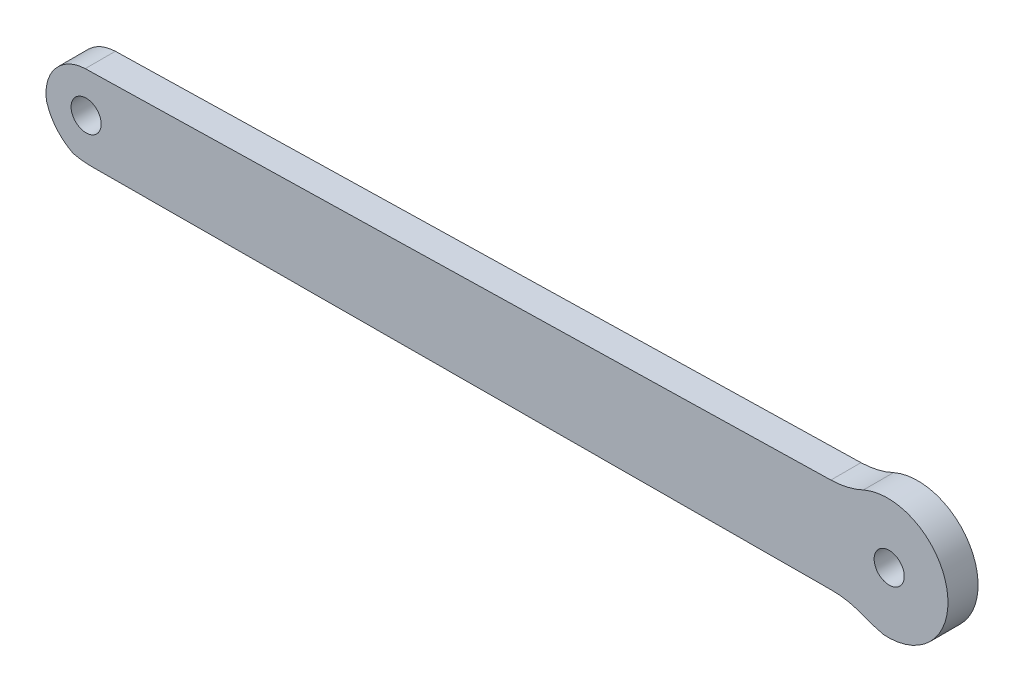
ISO-10303-21;
HEADER;
FILE_DESCRIPTION(('STEP AP214'),'2;1');
FILE_NAME('part.step','',(''),(''),'','','');
FILE_SCHEMA(('AUTOMOTIVE_DESIGN { 1 0 10303 214 1 1 1 1 }'));
ENDSEC;
DATA;
#1=APPLICATION_CONTEXT('core data for automotive mechanical design processes');
#2=APPLICATION_PROTOCOL_DEFINITION('international standard','automotive_design',2000,#1);
#3=PRODUCT_CONTEXT('',#1,'mechanical');
#4=PRODUCT('Part','Part','',(#3));
#5=PRODUCT_RELATED_PRODUCT_CATEGORY('part','',(#4));
#6=PRODUCT_DEFINITION_FORMATION('','',#4);
#7=PRODUCT_DEFINITION_CONTEXT('part definition',#1,'design');
#8=PRODUCT_DEFINITION('design','',#6,#7);
#9=PRODUCT_DEFINITION_SHAPE('','',#8);
#10=(LENGTH_UNIT() NAMED_UNIT(*) SI_UNIT(.MILLI.,.METRE.));
#11=(NAMED_UNIT(*) PLANE_ANGLE_UNIT() SI_UNIT($,.RADIAN.));
#12=(NAMED_UNIT(*) SI_UNIT($,.STERADIAN.) SOLID_ANGLE_UNIT());
#13=UNCERTAINTY_MEASURE_WITH_UNIT(LENGTH_MEASURE(1.E-05),#10,'distance_accuracy_value','');
#14=(GEOMETRIC_REPRESENTATION_CONTEXT(3) GLOBAL_UNCERTAINTY_ASSIGNED_CONTEXT((#13)) GLOBAL_UNIT_ASSIGNED_CONTEXT((#10,
#11,#12)) REPRESENTATION_CONTEXT('',''));
#15=CARTESIAN_POINT('',(0.,0.,0.));
#16=DIRECTION('',(0.,0.,1.));
#17=DIRECTION('',(1.,0.,0.));
#18=AXIS2_PLACEMENT_3D('',#15,#16,#17);
#19=CARTESIAN_POINT('',(83.7867001555837,164.469026190635,3.));
#20=DIRECTION('',(0.,0.,1.));
#21=DIRECTION('',(1.,0.,0.));
#22=AXIS2_PLACEMENT_3D('',#19,#20,#21);
#23=PLANE('',#22);
#24=CARTESIAN_POINT('',(89.7718472401299,151.812467685397,3.));
#25=DIRECTION('',(0.,0.,1.));
#26=DIRECTION('',(1.,0.,0.));
#27=AXIS2_PLACEMENT_3D('',#24,#25,#26);
#28=CIRCLE('',#27,1.49999999999998);
#29=CARTESIAN_POINT('',(91.2718472401299,151.812467685397,3.));
#30=VERTEX_POINT('',#29);
#31=EDGE_CURVE('E146',#30,#30,#28,.T.);
#32=ORIENTED_EDGE('',*,*,#31,.F.);
#33=EDGE_LOOP('',(#32));
#34=FACE_BOUND('',#33,.T.);
#35=CARTESIAN_POINT('',(83.7867001555837,164.469026190635,3.));
#36=DIRECTION('',(0.,0.,-1.));
#37=DIRECTION('',(1.,0.,0.));
#38=AXIS2_PLACEMENT_3D('',#35,#36,#37);
#39=CIRCLE('',#38,8.00040344487922);
#40=CARTESIAN_POINT('',(87.2068985072511,157.236550921677,3.));
#41=VERTEX_POINT('',#40);
#42=CARTESIAN_POINT('',(83.9642785340564,156.470593769195,3.));
#43=VERTEX_POINT('',#42);
#44=EDGE_CURVE('E161',#41,#43,#39,.T.);
#45=ORIENTED_EDGE('',*,*,#44,.T.);
#46=DIRECTION('',(-0.999754351339683,-0.0221638664806151,0.));
#47=VECTOR('',#46,1.);
#48=CARTESIAN_POINT('',(83.9642785340564,156.470593769195,3.));
#49=LINE('',#48,#47);
#50=CARTESIAN_POINT('',(9.68932855910709,154.823969203977,3.));
#51=VERTEX_POINT('',#50);
#52=EDGE_CURVE('E99',#43,#51,#49,.T.);
#53=ORIENTED_EDGE('',*,*,#52,.T.);
#54=CARTESIAN_POINT('',(9.85852986234285,150.747145406072,3.));
#55=DIRECTION('',(0.,0.,1.));
#56=DIRECTION('',(1.,0.,0.));
#57=AXIS2_PLACEMENT_3D('',#54,#55,#56);
#58=CIRCLE('',#57,4.08033348639364);
#59=CARTESIAN_POINT('',(5.82514565190696,150.129947568104,3.));
#60=VERTEX_POINT('',#59);
#61=EDGE_CURVE('E182',#51,#60,#58,.T.);
#62=ORIENTED_EDGE('',*,*,#61,.T.);
#63=CARTESIAN_POINT('',(10.8090030725797,151.532819219976,3.));
#64=DIRECTION('',(0.,0.,1.));
#65=DIRECTION('',(1.,0.,0.));
#66=AXIS2_PLACEMENT_3D('',#63,#64,#65);
#67=CIRCLE('',#66,5.17753644711641);
#68=CARTESIAN_POINT('',(8.49347494000333,146.90192156094,3.));
#69=VERTEX_POINT('',#68);
#70=EDGE_CURVE('E201',#60,#69,#67,.T.);
#71=ORIENTED_EDGE('',*,*,#70,.T.);
#72=CARTESIAN_POINT('',(10.3020977189821,154.695436505625,3.));
#73=DIRECTION('',(0.,0.,1.));
#74=DIRECTION('',(1.,0.,0.));
#75=AXIS2_PLACEMENT_3D('',#72,#73,#74);
#76=CIRCLE('',#75,8.0006244474833);
#77=CARTESIAN_POINT('',(10.3363477725171,146.694885369391,3.));
#78=VERTEX_POINT('',#77);
#79=EDGE_CURVE('E198',#69,#78,#76,.T.);
#80=ORIENTED_EDGE('',*,*,#79,.T.);
#81=DIRECTION('',(0.999990723069275,0.00430740935922885,0.));
#82=VECTOR('',#81,1.);
#83=CARTESIAN_POINT('',(10.3363477725171,146.694885369391,3.));
#84=LINE('',#83,#82);
#85=CARTESIAN_POINT('',(28.4307616397135,146.772826140083,3.));
#86=VERTEX_POINT('',#85);
#87=EDGE_CURVE('E200',#78,#86,#84,.T.);
#88=ORIENTED_EDGE('',*,*,#87,.T.);
#89=DIRECTION('',(0.99999074479343,0.00430236301140441,0.));
#90=VECTOR('',#89,1.);
#91=CARTESIAN_POINT('',(28.4307616397135,146.772826140083,3.));
#92=LINE('',#91,#90);
#93=CARTESIAN_POINT('',(84.0810405641763,147.012256057675,3.));
#94=VERTEX_POINT('',#93);
#95=EDGE_CURVE('E124',#86,#94,#92,.T.);
#96=ORIENTED_EDGE('',*,*,#95,.T.);
#97=CARTESIAN_POINT('',(84.1015346193672,139.013985829993,3.));
#98=DIRECTION('',(0.,0.,-1.));
#99=DIRECTION('',(1.,0.,0.));
#100=AXIS2_PLACEMENT_3D('',#97,#98,#99);
#101=CIRCLE('',#100,7.99829648371016);
#102=CARTESIAN_POINT('',(87.3415370568645,146.326655031204,3.));
#103=VERTEX_POINT('',#102);
#104=EDGE_CURVE('E118',#94,#103,#101,.T.);
#105=ORIENTED_EDGE('',*,*,#104,.T.);
#106=CARTESIAN_POINT('',(93.709289011018,163.980295508004,3.));
#107=DIRECTION('',(0.,0.,1.));
#108=DIRECTION('',(1.,0.,0.));
#109=AXIS2_PLACEMENT_3D('',#106,#107,#108);
#110=CIRCLE('',#109,18.7669733050843);
#111=CARTESIAN_POINT('',(89.2137207556054,145.759726002781,3.));
#112=VERTEX_POINT('',#111);
#113=EDGE_CURVE('E122',#103,#112,#110,.T.);
#114=ORIENTED_EDGE('',*,*,#113,.T.);
#115=CARTESIAN_POINT('',(89.6265375089271,151.745778173856,3.));
#116=DIRECTION('',(0.,0.,1.));
#117=DIRECTION('',(1.,0.,0.));
#118=AXIS2_PLACEMENT_3D('',#115,#116,#117);
#119=CIRCLE('',#118,6.00026984948586);
#120=EDGE_CURVE('E50',#112,#41,#119,.T.);
#121=ORIENTED_EDGE('',*,*,#120,.T.);
#122=EDGE_LOOP('',(#45,#53,#62,#71,#80,#88,#96,#105,#114,#121));
#123=FACE_BOUND('',#122,.T.);
#124=CARTESIAN_POINT('',(9.77798402665884,150.824951800321,3.));
#125=DIRECTION('',(0.,0.,1.));
#126=DIRECTION('',(1.,0.,0.));
#127=AXIS2_PLACEMENT_3D('',#124,#125,#126);
#128=CIRCLE('',#127,1.5);
#129=CARTESIAN_POINT('',(11.2779840266588,150.824951800321,3.));
#130=VERTEX_POINT('',#129);
#131=EDGE_CURVE('E212',#130,#130,#128,.T.);
#132=ORIENTED_EDGE('',*,*,#131,.F.);
#133=EDGE_LOOP('',(#132));
#134=FACE_BOUND('',#133,.T.);
#135=ADVANCED_FACE('F33',(#34,#123,#134),#23,.T.);
#136=CARTESIAN_POINT('',(83.7867001555837,164.469026190635,0.));
#137=DIRECTION('',(0.,0.,1.));
#138=DIRECTION('',(1.,0.,0.));
#139=AXIS2_PLACEMENT_3D('',#136,#137,#138);
#140=PLANE('',#139);
#141=CARTESIAN_POINT('',(83.7867001555837,164.469026190635,0.));
#142=DIRECTION('',(0.,0.,-1.));
#143=DIRECTION('',(1.,0.,0.));
#144=AXIS2_PLACEMENT_3D('',#141,#142,#143);
#145=CIRCLE('',#144,8.00040344487922);
#146=CARTESIAN_POINT('',(87.2068985072511,157.236550921677,0.));
#147=VERTEX_POINT('',#146);
#148=CARTESIAN_POINT('',(83.9642785340564,156.470593769195,0.));
#149=VERTEX_POINT('',#148);
#150=EDGE_CURVE('E142',#147,#149,#145,.T.);
#151=ORIENTED_EDGE('',*,*,#150,.F.);
#152=CARTESIAN_POINT('',(89.6265375089271,151.745778173856,0.));
#153=DIRECTION('',(0.,0.,1.));
#154=DIRECTION('',(1.,0.,0.));
#155=AXIS2_PLACEMENT_3D('',#152,#153,#154);
#156=CIRCLE('',#155,6.00026984948586);
#157=CARTESIAN_POINT('',(89.2137207556054,145.759726002781,0.));
#158=VERTEX_POINT('',#157);
#159=EDGE_CURVE('E91',#158,#147,#156,.T.);
#160=ORIENTED_EDGE('',*,*,#159,.F.);
#161=CARTESIAN_POINT('',(93.709289011018,163.980295508004,0.));
#162=DIRECTION('',(0.,0.,1.));
#163=DIRECTION('',(1.,0.,0.));
#164=AXIS2_PLACEMENT_3D('',#161,#162,#163);
#165=CIRCLE('',#164,18.7669733050843);
#166=CARTESIAN_POINT('',(87.3415370568645,146.326655031204,0.));
#167=VERTEX_POINT('',#166);
#168=EDGE_CURVE('E85',#167,#158,#165,.T.);
#169=ORIENTED_EDGE('',*,*,#168,.F.);
#170=CARTESIAN_POINT('',(84.1015346193672,139.013985829993,0.));
#171=DIRECTION('',(0.,0.,-1.));
#172=DIRECTION('',(1.,0.,0.));
#173=AXIS2_PLACEMENT_3D('',#170,#171,#172);
#174=CIRCLE('',#173,7.99829648371016);
#175=CARTESIAN_POINT('',(84.0810405641763,147.012256057675,0.));
#176=VERTEX_POINT('',#175);
#177=EDGE_CURVE('E132',#176,#167,#174,.T.);
#178=ORIENTED_EDGE('',*,*,#177,.F.);
#179=DIRECTION('',(0.99999074479343,0.00430236301140441,0.));
#180=VECTOR('',#179,1.);
#181=CARTESIAN_POINT('',(28.4307616397135,146.772826140083,0.));
#182=LINE('',#181,#180);
#183=CARTESIAN_POINT('',(28.4307616397135,146.772826140083,0.));
#184=VERTEX_POINT('',#183);
#185=EDGE_CURVE('E156',#184,#176,#182,.T.);
#186=ORIENTED_EDGE('',*,*,#185,.F.);
#187=DIRECTION('',(0.999990723069275,0.00430740935922885,0.));
#188=VECTOR('',#187,1.);
#189=CARTESIAN_POINT('',(10.3363477725171,146.694885369391,0.));
#190=LINE('',#189,#188);
#191=CARTESIAN_POINT('',(10.3363477725171,146.694885369391,0.));
#192=VERTEX_POINT('',#191);
#193=EDGE_CURVE('E154',#192,#184,#190,.T.);
#194=ORIENTED_EDGE('',*,*,#193,.F.);
#195=CARTESIAN_POINT('',(10.3020977189821,154.695436505625,0.));
#196=DIRECTION('',(0.,0.,1.));
#197=DIRECTION('',(1.,0.,0.));
#198=AXIS2_PLACEMENT_3D('',#195,#196,#197);
#199=CIRCLE('',#198,8.0006244474833);
#200=CARTESIAN_POINT('',(8.49347494000333,146.90192156094,0.));
#201=VERTEX_POINT('',#200);
#202=EDGE_CURVE('E152',#201,#192,#199,.T.);
#203=ORIENTED_EDGE('',*,*,#202,.F.);
#204=CARTESIAN_POINT('',(10.8090030725797,151.532819219976,0.));
#205=DIRECTION('',(0.,0.,1.));
#206=DIRECTION('',(1.,0.,0.));
#207=AXIS2_PLACEMENT_3D('',#204,#205,#206);
#208=CIRCLE('',#207,5.17753644711641);
#209=CARTESIAN_POINT('',(5.82514565190696,150.129947568104,0.));
#210=VERTEX_POINT('',#209);
#211=EDGE_CURVE('E150',#210,#201,#208,.T.);
#212=ORIENTED_EDGE('',*,*,#211,.F.);
#213=CARTESIAN_POINT('',(9.85852986234285,150.747145406072,0.));
#214=DIRECTION('',(0.,0.,1.));
#215=DIRECTION('',(1.,0.,0.));
#216=AXIS2_PLACEMENT_3D('',#213,#214,#215);
#217=CIRCLE('',#216,4.08033348639364);
#218=CARTESIAN_POINT('',(9.68932855910709,154.823969203977,0.));
#219=VERTEX_POINT('',#218);
#220=EDGE_CURVE('E148',#219,#210,#217,.T.);
#221=ORIENTED_EDGE('',*,*,#220,.F.);
#222=DIRECTION('',(-0.999754351339683,-0.0221638664806151,0.));
#223=VECTOR('',#222,1.);
#224=CARTESIAN_POINT('',(83.9642785340564,156.470593769195,0.));
#225=LINE('',#224,#223);
#226=EDGE_CURVE('E145',#149,#219,#225,.T.);
#227=ORIENTED_EDGE('',*,*,#226,.F.);
#228=EDGE_LOOP('',(#151,#160,#169,#178,#186,#194,#203,#212,#221,#227));
#229=FACE_BOUND('',#228,.T.);
#230=CARTESIAN_POINT('',(89.7718472401299,151.812467685397,0.));
#231=DIRECTION('',(0.,0.,1.));
#232=DIRECTION('',(1.,0.,0.));
#233=AXIS2_PLACEMENT_3D('',#230,#231,#232);
#234=CIRCLE('',#233,1.49999999999998);
#235=CARTESIAN_POINT('',(91.2718472401299,151.812467685397,0.));
#236=VERTEX_POINT('',#235);
#237=EDGE_CURVE('E209',#236,#236,#234,.T.);
#238=ORIENTED_EDGE('',*,*,#237,.T.);
#239=EDGE_LOOP('',(#238));
#240=FACE_BOUND('',#239,.T.);
#241=CARTESIAN_POINT('',(9.77798402665884,150.824951800321,0.));
#242=DIRECTION('',(0.,0.,1.));
#243=DIRECTION('',(1.,0.,0.));
#244=AXIS2_PLACEMENT_3D('',#241,#242,#243);
#245=CIRCLE('',#244,1.5);
#246=CARTESIAN_POINT('',(11.2779840266588,150.824951800321,0.));
#247=VERTEX_POINT('',#246);
#248=EDGE_CURVE('E215',#247,#247,#245,.T.);
#249=ORIENTED_EDGE('',*,*,#248,.T.);
#250=EDGE_LOOP('',(#249));
#251=FACE_BOUND('',#250,.T.);
#252=ADVANCED_FACE('F186',(#229,#240,#251),#140,.F.);
#253=CARTESIAN_POINT('',(83.7867001555837,164.469026190635,3.));
#254=DIRECTION('',(0.,0.,-1.));
#255=DIRECTION('',(-1.,0.,0.));
#256=AXIS2_PLACEMENT_3D('',#253,#254,#255);
#257=CYLINDRICAL_SURFACE('',#256,8.00040344487922);
#258=ORIENTED_EDGE('',*,*,#150,.T.);
#259=DIRECTION('',(0.,0.,-1.));
#260=VECTOR('',#259,1.);
#261=CARTESIAN_POINT('',(83.9642785340564,156.470593769195,3.));
#262=LINE('',#261,#260);
#263=EDGE_CURVE('E11',#43,#149,#262,.T.);
#264=ORIENTED_EDGE('',*,*,#263,.F.);
#265=ORIENTED_EDGE('',*,*,#44,.F.);
#266=DIRECTION('',(0.,0.,-1.));
#267=VECTOR('',#266,1.);
#268=CARTESIAN_POINT('',(87.2068985072511,157.236550921677,3.));
#269=LINE('',#268,#267);
#270=EDGE_CURVE('E138',#41,#147,#269,.T.);
#271=ORIENTED_EDGE('',*,*,#270,.T.);
#272=EDGE_LOOP('',(#258,#264,#265,#271));
#273=FACE_BOUND('',#272,.T.);
#274=ADVANCED_FACE('F35',(#273),#257,.F.);
#275=CARTESIAN_POINT('',(83.9642785340564,156.470593769195,3.));
#276=DIRECTION('',(0.0221638664806151,-0.999754351339682,0.));
#277=DIRECTION('',(0.999754351339683,0.0221638664806151,0.));
#278=AXIS2_PLACEMENT_3D('',#275,#276,#277);
#279=PLANE('',#278);
#280=ORIENTED_EDGE('',*,*,#226,.T.);
#281=DIRECTION('',(0.,0.,-1.));
#282=VECTOR('',#281,1.);
#283=CARTESIAN_POINT('',(9.68932855910709,154.823969203977,3.));
#284=LINE('',#283,#282);
#285=EDGE_CURVE('E42',#51,#219,#284,.T.);
#286=ORIENTED_EDGE('',*,*,#285,.F.);
#287=ORIENTED_EDGE('',*,*,#52,.F.);
#288=ORIENTED_EDGE('',*,*,#263,.T.);
#289=EDGE_LOOP('',(#280,#286,#287,#288));
#290=FACE_BOUND('',#289,.T.);
#291=ADVANCED_FACE('F255',(#290),#279,.F.);
#292=CARTESIAN_POINT('',(9.85852986234285,150.747145406072,3.));
#293=DIRECTION('',(0.,0.,-1.));
#294=DIRECTION('',(-1.,0.,0.));
#295=AXIS2_PLACEMENT_3D('',#292,#293,#294);
#296=CYLINDRICAL_SURFACE('',#295,4.08033348639364);
#297=ORIENTED_EDGE('',*,*,#220,.T.);
#298=DIRECTION('',(0.,0.,-1.));
#299=VECTOR('',#298,1.);
#300=CARTESIAN_POINT('',(5.82514565190696,150.129947568104,3.));
#301=LINE('',#300,#299);
#302=EDGE_CURVE('E174',#60,#210,#301,.T.);
#303=ORIENTED_EDGE('',*,*,#302,.F.);
#304=ORIENTED_EDGE('',*,*,#61,.F.);
#305=ORIENTED_EDGE('',*,*,#285,.T.);
#306=EDGE_LOOP('',(#297,#303,#304,#305));
#307=FACE_BOUND('',#306,.T.);
#308=ADVANCED_FACE('F180',(#307),#296,.T.);
#309=CARTESIAN_POINT('',(10.8090030725797,151.532819219976,3.));
#310=DIRECTION('',(0.,0.,-1.));
#311=DIRECTION('',(-1.,0.,0.));
#312=AXIS2_PLACEMENT_3D('',#309,#310,#311);
#313=CYLINDRICAL_SURFACE('',#312,5.17753644711641);
#314=ORIENTED_EDGE('',*,*,#211,.T.);
#315=DIRECTION('',(0.,0.,-1.));
#316=VECTOR('',#315,1.);
#317=CARTESIAN_POINT('',(8.49347494000333,146.90192156094,3.));
#318=LINE('',#317,#316);
#319=EDGE_CURVE('E171',#69,#201,#318,.T.);
#320=ORIENTED_EDGE('',*,*,#319,.F.);
#321=ORIENTED_EDGE('',*,*,#70,.F.);
#322=ORIENTED_EDGE('',*,*,#302,.T.);
#323=EDGE_LOOP('',(#314,#320,#321,#322));
#324=FACE_BOUND('',#323,.T.);
#325=ADVANCED_FACE('F192',(#324),#313,.T.);
#326=CARTESIAN_POINT('',(10.3020977189821,154.695436505625,3.));
#327=DIRECTION('',(0.,0.,-1.));
#328=DIRECTION('',(-1.,0.,0.));
#329=AXIS2_PLACEMENT_3D('',#326,#327,#328);
#330=CYLINDRICAL_SURFACE('',#329,8.0006244474833);
#331=ORIENTED_EDGE('',*,*,#202,.T.);
#332=DIRECTION('',(0.,0.,-1.));
#333=VECTOR('',#332,1.);
#334=CARTESIAN_POINT('',(10.3363477725171,146.694885369391,3.));
#335=LINE('',#334,#333);
#336=EDGE_CURVE('E168',#78,#192,#335,.T.);
#337=ORIENTED_EDGE('',*,*,#336,.F.);
#338=ORIENTED_EDGE('',*,*,#79,.F.);
#339=ORIENTED_EDGE('',*,*,#319,.T.);
#340=EDGE_LOOP('',(#331,#337,#338,#339));
#341=FACE_BOUND('',#340,.T.);
#342=ADVANCED_FACE('F196',(#341),#330,.T.);
#343=CARTESIAN_POINT('',(10.3363477725171,146.694885369391,3.));
#344=DIRECTION('',(-0.00430740935922885,0.999990723069275,0.));
#345=DIRECTION('',(-0.999990723069275,-0.00430740935922885,0.));
#346=AXIS2_PLACEMENT_3D('',#343,#344,#345);
#347=PLANE('',#346);
#348=ORIENTED_EDGE('',*,*,#193,.T.);
#349=DIRECTION('',(0.,0.,-1.));
#350=VECTOR('',#349,1.);
#351=CARTESIAN_POINT('',(28.4307616397135,146.772826140083,3.));
#352=LINE('',#351,#350);
#353=EDGE_CURVE('E165',#86,#184,#352,.T.);
#354=ORIENTED_EDGE('',*,*,#353,.F.);
#355=ORIENTED_EDGE('',*,*,#87,.F.);
#356=ORIENTED_EDGE('',*,*,#336,.T.);
#357=EDGE_LOOP('',(#348,#354,#355,#356));
#358=FACE_BOUND('',#357,.T.);
#359=ADVANCED_FACE('F245',(#358),#347,.F.);
#360=CARTESIAN_POINT('',(28.4307616397135,146.772826140083,3.));
#361=DIRECTION('',(-0.00430236301140441,0.99999074479343,0.));
#362=DIRECTION('',(-0.99999074479343,-0.00430236301140441,0.));
#363=AXIS2_PLACEMENT_3D('',#360,#361,#362);
#364=PLANE('',#363);
#365=ORIENTED_EDGE('',*,*,#185,.T.);
#366=DIRECTION('',(0.,0.,-1.));
#367=VECTOR('',#366,1.);
#368=CARTESIAN_POINT('',(84.0810405641763,147.012256057675,3.));
#369=LINE('',#368,#367);
#370=EDGE_CURVE('E133',#94,#176,#369,.T.);
#371=ORIENTED_EDGE('',*,*,#370,.F.);
#372=ORIENTED_EDGE('',*,*,#95,.F.);
#373=ORIENTED_EDGE('',*,*,#353,.T.);
#374=EDGE_LOOP('',(#365,#371,#372,#373));
#375=FACE_BOUND('',#374,.T.);
#376=ADVANCED_FACE('F242',(#375),#364,.F.);
#377=CARTESIAN_POINT('',(84.1015346193672,139.013985829993,3.));
#378=DIRECTION('',(0.,0.,-1.));
#379=DIRECTION('',(-1.,0.,0.));
#380=AXIS2_PLACEMENT_3D('',#377,#378,#379);
#381=CYLINDRICAL_SURFACE('',#380,7.99829648371016);
#382=ORIENTED_EDGE('',*,*,#177,.T.);
#383=DIRECTION('',(0.,0.,-1.));
#384=VECTOR('',#383,1.);
#385=CARTESIAN_POINT('',(87.3415370568645,146.326655031204,3.));
#386=LINE('',#385,#384);
#387=EDGE_CURVE('E129',#103,#167,#386,.T.);
#388=ORIENTED_EDGE('',*,*,#387,.F.);
#389=ORIENTED_EDGE('',*,*,#104,.F.);
#390=ORIENTED_EDGE('',*,*,#370,.T.);
#391=EDGE_LOOP('',(#382,#388,#389,#390));
#392=FACE_BOUND('',#391,.T.);
#393=ADVANCED_FACE('F130',(#392),#381,.F.);
#394=CARTESIAN_POINT('',(93.709289011018,163.980295508004,3.));
#395=DIRECTION('',(0.,0.,-1.));
#396=DIRECTION('',(-1.,0.,0.));
#397=AXIS2_PLACEMENT_3D('',#394,#395,#396);
#398=CYLINDRICAL_SURFACE('',#397,18.7669733050843);
#399=ORIENTED_EDGE('',*,*,#168,.T.);
#400=DIRECTION('',(0.,0.,-1.));
#401=VECTOR('',#400,1.);
#402=CARTESIAN_POINT('',(89.2137207556054,145.759726002781,3.));
#403=LINE('',#402,#401);
#404=EDGE_CURVE('E134',#112,#158,#403,.T.);
#405=ORIENTED_EDGE('',*,*,#404,.F.);
#406=ORIENTED_EDGE('',*,*,#113,.F.);
#407=ORIENTED_EDGE('',*,*,#387,.T.);
#408=EDGE_LOOP('',(#399,#405,#406,#407));
#409=FACE_BOUND('',#408,.T.);
#410=ADVANCED_FACE('F136',(#409),#398,.T.);
#411=CARTESIAN_POINT('',(89.6265375089271,151.745778173856,3.));
#412=DIRECTION('',(0.,0.,-1.));
#413=DIRECTION('',(-1.,0.,0.));
#414=AXIS2_PLACEMENT_3D('',#411,#412,#413);
#415=CYLINDRICAL_SURFACE('',#414,6.00026984948586);
#416=ORIENTED_EDGE('',*,*,#159,.T.);
#417=ORIENTED_EDGE('',*,*,#270,.F.);
#418=ORIENTED_EDGE('',*,*,#120,.F.);
#419=ORIENTED_EDGE('',*,*,#404,.T.);
#420=EDGE_LOOP('',(#416,#417,#418,#419));
#421=FACE_BOUND('',#420,.T.);
#422=ADVANCED_FACE('F235',(#421),#415,.T.);
#423=CARTESIAN_POINT('',(89.7718472401299,151.812467685397,3.));
#424=DIRECTION('',(0.,0.,-1.));
#425=DIRECTION('',(-1.,0.,0.));
#426=AXIS2_PLACEMENT_3D('',#423,#424,#425);
#427=CYLINDRICAL_SURFACE('',#426,1.49999999999998);
#428=ORIENTED_EDGE('',*,*,#31,.T.);
#429=EDGE_LOOP('',(#428));
#430=FACE_BOUND('',#429,.T.);
#431=ORIENTED_EDGE('',*,*,#237,.F.);
#432=EDGE_LOOP('',(#431));
#433=FACE_BOUND('',#432,.T.);
#434=ADVANCED_FACE('F232',(#430,#433),#427,.F.);
#435=CARTESIAN_POINT('',(9.77798402665884,150.824951800321,3.));
#436=DIRECTION('',(0.,0.,-1.));
#437=DIRECTION('',(-1.,0.,0.));
#438=AXIS2_PLACEMENT_3D('',#435,#436,#437);
#439=CYLINDRICAL_SURFACE('',#438,1.5);
#440=ORIENTED_EDGE('',*,*,#131,.T.);
#441=EDGE_LOOP('',(#440));
#442=FACE_BOUND('',#441,.T.);
#443=ORIENTED_EDGE('',*,*,#248,.F.);
#444=EDGE_LOOP('',(#443));
#445=FACE_BOUND('',#444,.T.);
#446=ADVANCED_FACE('F221',(#442,#445),#439,.F.);
#447=CLOSED_SHELL('',(#135,#252,#274,#291,#308,#325,#342,#359,#376,#393,#410,#422,#434,#446));
#448=MANIFOLD_SOLID_BREP('B2',#447);
#449=ADVANCED_BREP_SHAPE_REPRESENTATION('',(#18,#448),#14);
#450=SHAPE_DEFINITION_REPRESENTATION(#9,#449);
ENDSEC;
END-ISO-10303-21;
